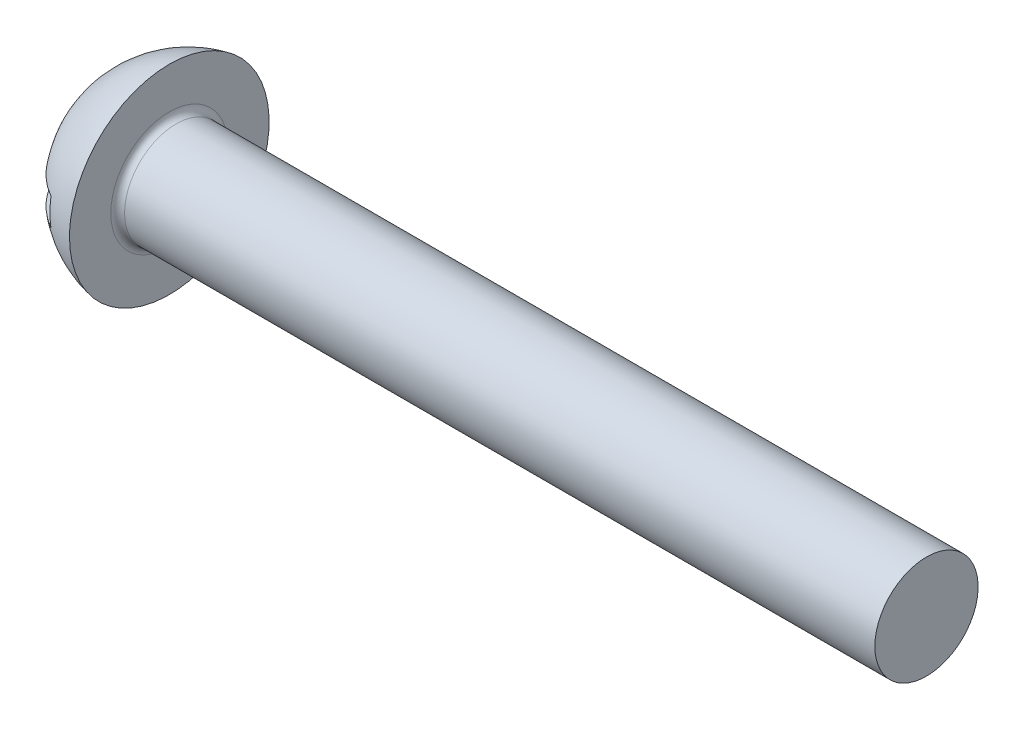
ISO-10303-21;
HEADER;
FILE_DESCRIPTION(('STEP AP214'),'2;1');
FILE_NAME('part.step','',(''),(''),'','','');
FILE_SCHEMA(('AUTOMOTIVE_DESIGN { 1 0 10303 214 1 1 1 1 }'));
ENDSEC;
DATA;
#1=APPLICATION_CONTEXT('core data for automotive mechanical design processes');
#2=APPLICATION_PROTOCOL_DEFINITION('international standard','automotive_design',2000,#1);
#3=PRODUCT_CONTEXT('',#1,'mechanical');
#4=PRODUCT('Part','Part','',(#3));
#5=PRODUCT_RELATED_PRODUCT_CATEGORY('part','',(#4));
#6=PRODUCT_DEFINITION_FORMATION('','',#4);
#7=PRODUCT_DEFINITION_CONTEXT('part definition',#1,'design');
#8=PRODUCT_DEFINITION('design','',#6,#7);
#9=PRODUCT_DEFINITION_SHAPE('','',#8);
#10=(LENGTH_UNIT() NAMED_UNIT(*) SI_UNIT(.MILLI.,.METRE.));
#11=(NAMED_UNIT(*) PLANE_ANGLE_UNIT() SI_UNIT($,.RADIAN.));
#12=(NAMED_UNIT(*) SI_UNIT($,.STERADIAN.) SOLID_ANGLE_UNIT());
#13=UNCERTAINTY_MEASURE_WITH_UNIT(LENGTH_MEASURE(1.E-05),#10,'distance_accuracy_value','');
#14=(GEOMETRIC_REPRESENTATION_CONTEXT(3) GLOBAL_UNCERTAINTY_ASSIGNED_CONTEXT((#13)) GLOBAL_UNIT_ASSIGNED_CONTEXT((#10,
#11,#12)) REPRESENTATION_CONTEXT('',''));
#15=CARTESIAN_POINT('',(0.,0.,0.));
#16=DIRECTION('',(0.,0.,1.));
#17=DIRECTION('',(1.,0.,0.));
#18=AXIS2_PLACEMENT_3D('',#15,#16,#17);
#19=CARTESIAN_POINT('',(2.95208333333333,0.,0.));
#20=DIRECTION('',(-1.,0.,0.));
#21=DIRECTION('',(0.,1.,0.));
#22=AXIS2_PLACEMENT_3D('',#19,#20,#21);
#23=SPHERICAL_SURFACE('',#22,2.95208333333333);
#24=CARTESIAN_POINT('',(2.95208333333333,0.4,0.));
#25=DIRECTION('',(0.,-1.,0.));
#26=DIRECTION('',(0.,0.,-1.));
#27=AXIS2_PLACEMENT_3D('',#24,#25,#26);
#28=CIRCLE('',#27,2.92485828835252);
#29=CARTESIAN_POINT('',(1.5,0.4,2.53894663197161));
#30=VERTEX_POINT('',#29);
#31=CARTESIAN_POINT('',(1.5,0.4,-2.53894663197161));
#32=VERTEX_POINT('',#31);
#33=EDGE_CURVE('E79',#30,#32,#28,.T.);
#34=ORIENTED_EDGE('',*,*,#33,.F.);
#35=CARTESIAN_POINT('',(1.5,0.,0.));
#36=DIRECTION('',(1.,0.,0.));
#37=DIRECTION('',(0.,0.,-1.));
#38=AXIS2_PLACEMENT_3D('',#35,#36,#37);
#39=CIRCLE('',#38,2.57026263249498);
#40=CARTESIAN_POINT('',(1.5,-0.4,2.53894663197161));
#41=VERTEX_POINT('',#40);
#42=EDGE_CURVE('E73',#30,#41,#39,.T.);
#43=ORIENTED_EDGE('',*,*,#42,.T.);
#44=CARTESIAN_POINT('',(2.95208333333333,-0.4,0.));
#45=DIRECTION('',(0.,1.,0.));
#46=DIRECTION('',(0.,0.,1.));
#47=AXIS2_PLACEMENT_3D('',#44,#45,#46);
#48=CIRCLE('',#47,2.92485828835252);
#49=CARTESIAN_POINT('',(1.5,-0.4,-2.53894663197161));
#50=VERTEX_POINT('',#49);
#51=EDGE_CURVE('E85',#50,#41,#48,.T.);
#52=ORIENTED_EDGE('',*,*,#51,.F.);
#53=EDGE_CURVE('E66',#50,#32,#39,.T.);
#54=ORIENTED_EDGE('',*,*,#53,.T.);
#55=EDGE_LOOP('',(#34,#43,#52,#54));
#56=FACE_BOUND('',#55,.T.);
#57=CARTESIAN_POINT('',(2.4,0.,0.));
#58=DIRECTION('',(-1.,0.,0.));
#59=DIRECTION('',(0.,0.,1.));
#60=AXIS2_PLACEMENT_3D('',#57,#58,#59);
#61=CIRCLE('',#60,2.9);
#62=CARTESIAN_POINT('',(2.4,0.,2.9));
#63=VERTEX_POINT('',#62);
#64=EDGE_CURVE('E130',#63,#63,#61,.T.);
#65=ORIENTED_EDGE('',*,*,#64,.T.);
#66=EDGE_LOOP('',(#65));
#67=FACE_BOUND('',#66,.T.);
#68=ADVANCED_FACE('F45',(#56,#67),#23,.T.);
#69=CARTESIAN_POINT('',(2.4,2.9,0.));
#70=DIRECTION('',(-1.,0.,0.));
#71=DIRECTION('',(0.,0.,1.));
#72=AXIS2_PLACEMENT_3D('',#69,#70,#71);
#73=PLANE('',#72);
#74=CARTESIAN_POINT('',(2.4,0.,0.));
#75=DIRECTION('',(-1.,0.,0.));
#76=DIRECTION('',(0.,0.,1.));
#77=AXIS2_PLACEMENT_3D('',#74,#75,#76);
#78=CIRCLE('',#77,1.7);
#79=CARTESIAN_POINT('',(2.4,0.,1.7));
#80=VERTEX_POINT('',#79);
#81=EDGE_CURVE('E54',#80,#80,#78,.T.);
#82=ORIENTED_EDGE('',*,*,#81,.T.);
#83=EDGE_LOOP('',(#82));
#84=FACE_BOUND('',#83,.T.);
#85=ORIENTED_EDGE('',*,*,#64,.F.);
#86=EDGE_LOOP('',(#85));
#87=FACE_BOUND('',#86,.T.);
#88=ADVANCED_FACE('F94',(#84,#87),#73,.F.);
#89=CARTESIAN_POINT('',(0.,0.,0.));
#90=DIRECTION('',(-1.,0.,0.));
#91=DIRECTION('',(0.,0.,1.));
#92=AXIS2_PLACEMENT_3D('',#89,#90,#91);
#93=CYLINDRICAL_SURFACE('',#92,1.5);
#94=CARTESIAN_POINT('',(2.6,0.,0.));
#95=DIRECTION('',(-1.,0.,0.));
#96=DIRECTION('',(0.,0.,1.));
#97=AXIS2_PLACEMENT_3D('',#94,#95,#96);
#98=CIRCLE('',#97,1.5);
#99=CARTESIAN_POINT('',(2.6,0.,1.5));
#100=VERTEX_POINT('',#99);
#101=EDGE_CURVE('E11',#100,#100,#98,.F.);
#102=ORIENTED_EDGE('',*,*,#101,.T.);
#103=EDGE_LOOP('',(#102));
#104=FACE_BOUND('',#103,.T.);
#105=CARTESIAN_POINT('',(24.4,0.,0.));
#106=DIRECTION('',(-1.,0.,0.));
#107=DIRECTION('',(0.,0.,1.));
#108=AXIS2_PLACEMENT_3D('',#105,#106,#107);
#109=CIRCLE('',#108,1.5);
#110=CARTESIAN_POINT('',(24.4,0.,1.5));
#111=VERTEX_POINT('',#110);
#112=EDGE_CURVE('E126',#111,#111,#109,.T.);
#113=ORIENTED_EDGE('',*,*,#112,.T.);
#114=EDGE_LOOP('',(#113));
#115=FACE_BOUND('',#114,.T.);
#116=ADVANCED_FACE('F112',(#104,#115),#93,.T.);
#117=CARTESIAN_POINT('',(24.4,1.5,0.));
#118=DIRECTION('',(-1.,0.,0.));
#119=DIRECTION('',(0.,0.,1.));
#120=AXIS2_PLACEMENT_3D('',#117,#118,#119);
#121=PLANE('',#120);
#122=ORIENTED_EDGE('',*,*,#112,.F.);
#123=EDGE_LOOP('',(#122));
#124=FACE_BOUND('',#123,.T.);
#125=ADVANCED_FACE('F117',(#124),#121,.F.);
#126=CARTESIAN_POINT('',(1.5,0.4,-2.9));
#127=DIRECTION('',(0.,-1.,0.));
#128=DIRECTION('',(0.,0.,-1.));
#129=AXIS2_PLACEMENT_3D('',#126,#127,#128);
#130=PLANE('',#129);
#131=ORIENTED_EDGE('',*,*,#33,.T.);
#132=DIRECTION('',(0.,0.,1.));
#133=VECTOR('',#132,1.);
#134=CARTESIAN_POINT('',(1.5,0.4,-2.9));
#135=LINE('',#134,#133);
#136=EDGE_CURVE('E61',#32,#30,#135,.T.);
#137=ORIENTED_EDGE('',*,*,#136,.T.);
#138=EDGE_LOOP('',(#131,#137));
#139=FACE_BOUND('',#138,.T.);
#140=ADVANCED_FACE('F82',(#139),#130,.T.);
#141=CARTESIAN_POINT('',(1.5,-0.4,2.9));
#142=DIRECTION('',(0.,1.,0.));
#143=DIRECTION('',(0.,0.,1.));
#144=AXIS2_PLACEMENT_3D('',#141,#142,#143);
#145=PLANE('',#144);
#146=ORIENTED_EDGE('',*,*,#51,.T.);
#147=DIRECTION('',(0.,0.,-1.));
#148=VECTOR('',#147,1.);
#149=CARTESIAN_POINT('',(1.5,-0.4,2.9));
#150=LINE('',#149,#148);
#151=EDGE_CURVE('E75',#41,#50,#150,.T.);
#152=ORIENTED_EDGE('',*,*,#151,.T.);
#153=EDGE_LOOP('',(#146,#152));
#154=FACE_BOUND('',#153,.T.);
#155=ADVANCED_FACE('F103',(#154),#145,.T.);
#156=CARTESIAN_POINT('',(1.5,0.4,-2.9));
#157=DIRECTION('',(1.,0.,0.));
#158=DIRECTION('',(0.,0.,-1.));
#159=AXIS2_PLACEMENT_3D('',#156,#157,#158);
#160=PLANE('',#159);
#161=ORIENTED_EDGE('',*,*,#136,.F.);
#162=ORIENTED_EDGE('',*,*,#53,.F.);
#163=ORIENTED_EDGE('',*,*,#151,.F.);
#164=ORIENTED_EDGE('',*,*,#42,.F.);
#165=EDGE_LOOP('',(#161,#162,#163,#164));
#166=FACE_BOUND('',#165,.T.);
#167=ADVANCED_FACE('F74',(#166),#160,.F.);
#168=CARTESIAN_POINT('',(2.6,0.,0.));
#169=DIRECTION('',(-1.,0.,0.));
#170=DIRECTION('',(0.,0.,1.));
#171=AXIS2_PLACEMENT_3D('',#168,#169,#170);
#172=TOROIDAL_SURFACE('',#171,1.7,0.2);
#173=ORIENTED_EDGE('',*,*,#101,.F.);
#174=EDGE_LOOP('',(#173));
#175=FACE_BOUND('',#174,.T.);
#176=ORIENTED_EDGE('',*,*,#81,.F.);
#177=EDGE_LOOP('',(#176));
#178=FACE_BOUND('',#177,.T.);
#179=ADVANCED_FACE('F47',(#175,#178),#172,.F.);
#180=CLOSED_SHELL('',(#68,#88,#116,#125,#140,#155,#167,#179));
#181=MANIFOLD_SOLID_BREP('B2',#180);
#182=ADVANCED_BREP_SHAPE_REPRESENTATION('',(#18,#181),#14);
#183=SHAPE_DEFINITION_REPRESENTATION(#9,#182);
ENDSEC;
END-ISO-10303-21;
